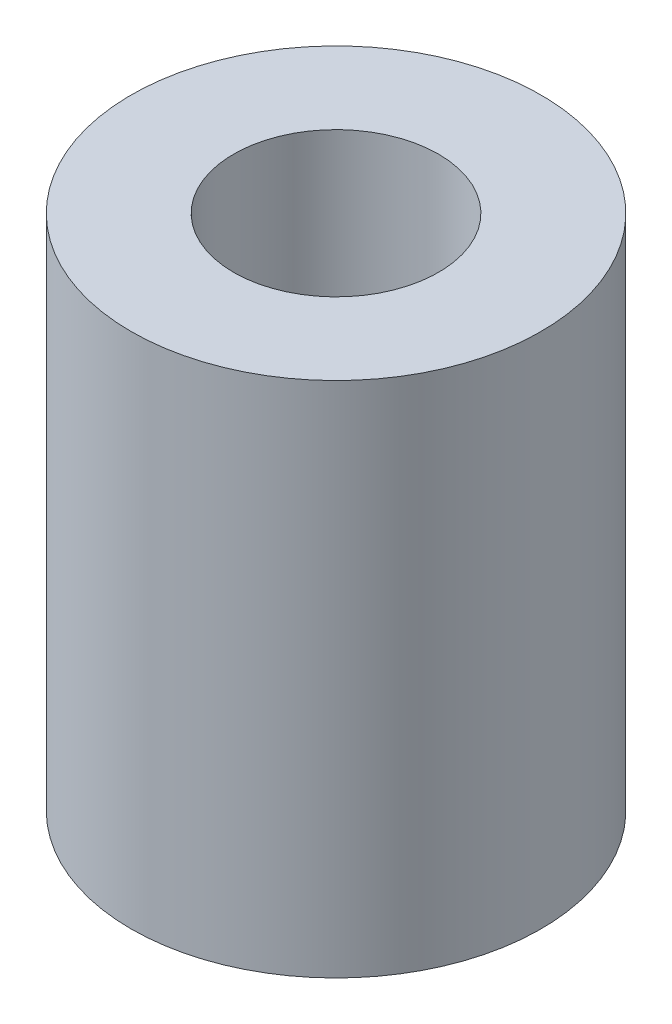
ISO-10303-21;
HEADER;
FILE_DESCRIPTION(('STEP AP214'),'2;1');
FILE_NAME('part.step','',(''),(''),'','','');
FILE_SCHEMA(('AUTOMOTIVE_DESIGN { 1 0 10303 214 1 1 1 1 }'));
ENDSEC;
DATA;
#1=APPLICATION_CONTEXT('core data for automotive mechanical design processes');
#2=APPLICATION_PROTOCOL_DEFINITION('international standard','automotive_design',2000,#1);
#3=PRODUCT_CONTEXT('',#1,'mechanical');
#4=PRODUCT('Part','Part','',(#3));
#5=PRODUCT_RELATED_PRODUCT_CATEGORY('part','',(#4));
#6=PRODUCT_DEFINITION_FORMATION('','',#4);
#7=PRODUCT_DEFINITION_CONTEXT('part definition',#1,'design');
#8=PRODUCT_DEFINITION('design','',#6,#7);
#9=PRODUCT_DEFINITION_SHAPE('','',#8);
#10=(LENGTH_UNIT() NAMED_UNIT(*) SI_UNIT(.MILLI.,.METRE.));
#11=(NAMED_UNIT(*) PLANE_ANGLE_UNIT() SI_UNIT($,.RADIAN.));
#12=(NAMED_UNIT(*) SI_UNIT($,.STERADIAN.) SOLID_ANGLE_UNIT());
#13=UNCERTAINTY_MEASURE_WITH_UNIT(LENGTH_MEASURE(1.E-05),#10,'distance_accuracy_value','');
#14=(GEOMETRIC_REPRESENTATION_CONTEXT(3) GLOBAL_UNCERTAINTY_ASSIGNED_CONTEXT((#13)) GLOBAL_UNIT_ASSIGNED_CONTEXT((#10,
#11,#12)) REPRESENTATION_CONTEXT('',''));
#15=CARTESIAN_POINT('',(0.,0.,0.));
#16=DIRECTION('',(0.,0.,1.));
#17=DIRECTION('',(1.,0.,0.));
#18=AXIS2_PLACEMENT_3D('',#15,#16,#17);
#19=CARTESIAN_POINT('',(0.,5.05,0.));
#20=DIRECTION('',(0.,1.,0.));
#21=DIRECTION('',(0.,0.,1.));
#22=AXIS2_PLACEMENT_3D('',#19,#20,#21);
#23=PLANE('',#22);
#24=CARTESIAN_POINT('',(0.,5.05,0.));
#25=DIRECTION('',(0.,1.,0.));
#26=DIRECTION('',(0.,0.,1.));
#27=AXIS2_PLACEMENT_3D('',#24,#25,#26);
#28=CIRCLE('',#27,2.);
#29=CARTESIAN_POINT('',(0.,5.05,2.));
#30=VERTEX_POINT('',#29);
#31=EDGE_CURVE('E12',#30,#30,#28,.T.);
#32=ORIENTED_EDGE('',*,*,#31,.T.);
#33=EDGE_LOOP('',(#32));
#34=FACE_BOUND('',#33,.T.);
#35=CARTESIAN_POINT('',(0.,5.05,0.));
#36=DIRECTION('',(0.,1.,0.));
#37=DIRECTION('',(0.,0.,1.));
#38=AXIS2_PLACEMENT_3D('',#35,#36,#37);
#39=CIRCLE('',#38,1.);
#40=CARTESIAN_POINT('',(0.,5.05,1.));
#41=VERTEX_POINT('',#40);
#42=EDGE_CURVE('E57',#41,#41,#39,.T.);
#43=ORIENTED_EDGE('',*,*,#42,.F.);
#44=EDGE_LOOP('',(#43));
#45=FACE_BOUND('',#44,.T.);
#46=ADVANCED_FACE('F46',(#34,#45),#23,.T.);
#47=CARTESIAN_POINT('',(0.,0.,0.));
#48=DIRECTION('',(0.,1.,0.));
#49=DIRECTION('',(0.,0.,1.));
#50=AXIS2_PLACEMENT_3D('',#47,#48,#49);
#51=PLANE('',#50);
#52=CARTESIAN_POINT('',(0.,0.,0.));
#53=DIRECTION('',(0.,1.,0.));
#54=DIRECTION('',(0.,0.,1.));
#55=AXIS2_PLACEMENT_3D('',#52,#53,#54);
#56=CIRCLE('',#55,2.);
#57=CARTESIAN_POINT('',(0.,0.,2.));
#58=VERTEX_POINT('',#57);
#59=EDGE_CURVE('E50',#58,#58,#56,.T.);
#60=ORIENTED_EDGE('',*,*,#59,.F.);
#61=EDGE_LOOP('',(#60));
#62=FACE_BOUND('',#61,.T.);
#63=CARTESIAN_POINT('',(0.,0.,0.));
#64=DIRECTION('',(0.,1.,0.));
#65=DIRECTION('',(0.,0.,1.));
#66=AXIS2_PLACEMENT_3D('',#63,#64,#65);
#67=CIRCLE('',#66,1.);
#68=CARTESIAN_POINT('',(0.,0.,1.));
#69=VERTEX_POINT('',#68);
#70=EDGE_CURVE('E59',#69,#69,#67,.T.);
#71=ORIENTED_EDGE('',*,*,#70,.T.);
#72=EDGE_LOOP('',(#71));
#73=FACE_BOUND('',#72,.T.);
#74=ADVANCED_FACE('F69',(#62,#73),#51,.F.);
#75=CARTESIAN_POINT('',(0.,5.05,0.));
#76=DIRECTION('',(0.,-1.,0.));
#77=DIRECTION('',(0.,0.,-1.));
#78=AXIS2_PLACEMENT_3D('',#75,#76,#77);
#79=CYLINDRICAL_SURFACE('',#78,2.);
#80=ORIENTED_EDGE('',*,*,#31,.F.);
#81=EDGE_LOOP('',(#80));
#82=FACE_BOUND('',#81,.T.);
#83=ORIENTED_EDGE('',*,*,#59,.T.);
#84=EDGE_LOOP('',(#83));
#85=FACE_BOUND('',#84,.T.);
#86=ADVANCED_FACE('F48',(#82,#85),#79,.T.);
#87=CARTESIAN_POINT('',(0.,5.05,0.));
#88=DIRECTION('',(0.,-1.,0.));
#89=DIRECTION('',(0.,0.,-1.));
#90=AXIS2_PLACEMENT_3D('',#87,#88,#89);
#91=CYLINDRICAL_SURFACE('',#90,1.);
#92=ORIENTED_EDGE('',*,*,#42,.T.);
#93=EDGE_LOOP('',(#92));
#94=FACE_BOUND('',#93,.T.);
#95=ORIENTED_EDGE('',*,*,#70,.F.);
#96=EDGE_LOOP('',(#95));
#97=FACE_BOUND('',#96,.T.);
#98=ADVANCED_FACE('F65',(#94,#97),#91,.F.);
#99=CLOSED_SHELL('',(#46,#74,#86,#98));
#100=MANIFOLD_SOLID_BREP('B2',#99);
#101=ADVANCED_BREP_SHAPE_REPRESENTATION('',(#18,#100),#14);
#102=SHAPE_DEFINITION_REPRESENTATION(#9,#101);
ENDSEC;
END-ISO-10303-21;
